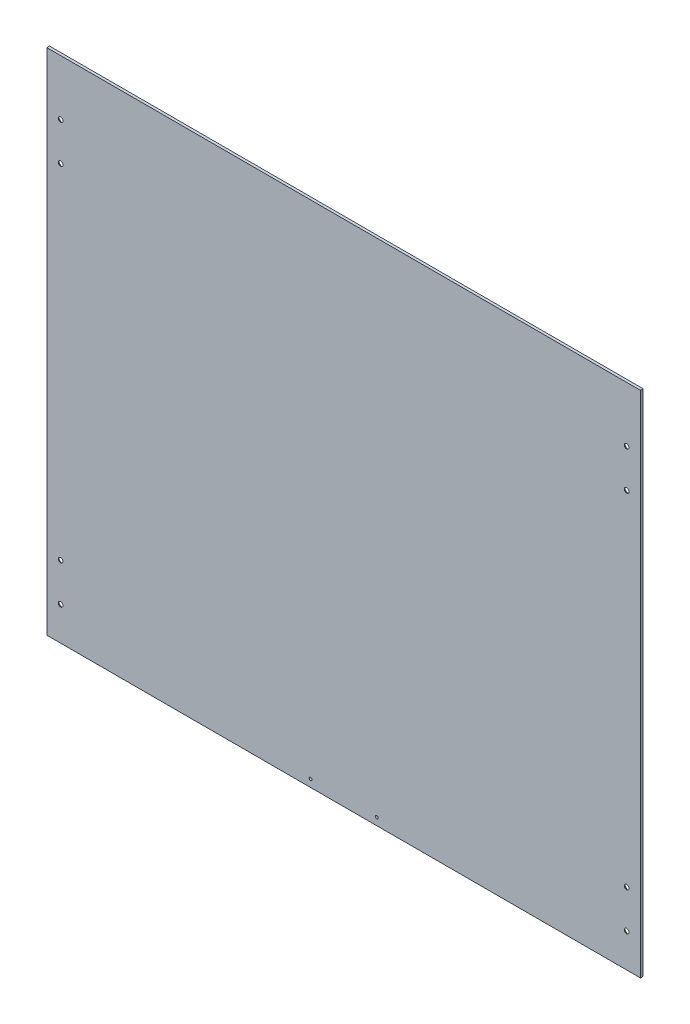
ISO-10303-21;
HEADER;
FILE_DESCRIPTION(('STEP AP214'),'2;1');
FILE_NAME('part.step','',(''),(''),'','','');
FILE_SCHEMA(('AUTOMOTIVE_DESIGN { 1 0 10303 214 1 1 1 1 }'));
ENDSEC;
DATA;
#1=APPLICATION_CONTEXT('core data for automotive mechanical design processes');
#2=APPLICATION_PROTOCOL_DEFINITION('international standard','automotive_design',2000,#1);
#3=PRODUCT_CONTEXT('',#1,'mechanical');
#4=PRODUCT('Part','Part','',(#3));
#5=PRODUCT_RELATED_PRODUCT_CATEGORY('part','',(#4));
#6=PRODUCT_DEFINITION_FORMATION('','',#4);
#7=PRODUCT_DEFINITION_CONTEXT('part definition',#1,'design');
#8=PRODUCT_DEFINITION('design','',#6,#7);
#9=PRODUCT_DEFINITION_SHAPE('','',#8);
#10=(LENGTH_UNIT() NAMED_UNIT(*) SI_UNIT(.MILLI.,.METRE.));
#11=(NAMED_UNIT(*) PLANE_ANGLE_UNIT() SI_UNIT($,.RADIAN.));
#12=(NAMED_UNIT(*) SI_UNIT($,.STERADIAN.) SOLID_ANGLE_UNIT());
#13=UNCERTAINTY_MEASURE_WITH_UNIT(LENGTH_MEASURE(1.E-05),#10,'distance_accuracy_value','');
#14=(GEOMETRIC_REPRESENTATION_CONTEXT(3) GLOBAL_UNCERTAINTY_ASSIGNED_CONTEXT((#13)) GLOBAL_UNIT_ASSIGNED_CONTEXT((#10,
#11,#12)) REPRESENTATION_CONTEXT('',''));
#15=CARTESIAN_POINT('',(0.,0.,0.));
#16=DIRECTION('',(0.,0.,1.));
#17=DIRECTION('',(1.,0.,0.));
#18=AXIS2_PLACEMENT_3D('',#15,#16,#17);
#19=CARTESIAN_POINT('',(-350.,300.,1.5875));
#20=DIRECTION('',(1.,0.,0.));
#21=DIRECTION('',(0.,1.,0.));
#22=AXIS2_PLACEMENT_3D('',#19,#20,#21);
#23=PLANE('',#22);
#24=DIRECTION('',(0.,-1.,0.));
#25=VECTOR('',#24,1.);
#26=CARTESIAN_POINT('',(-350.,300.,-1.5875));
#27=LINE('',#26,#25);
#28=CARTESIAN_POINT('',(-350.,300.,-1.5875));
#29=VERTEX_POINT('',#28);
#30=CARTESIAN_POINT('',(-350.,-300.,-1.5875));
#31=VERTEX_POINT('',#30);
#32=EDGE_CURVE('E99',#29,#31,#27,.T.);
#33=ORIENTED_EDGE('',*,*,#32,.T.);
#34=DIRECTION('',(0.,0.,-1.));
#35=VECTOR('',#34,1.);
#36=CARTESIAN_POINT('',(-350.,-300.,1.5875));
#37=LINE('',#36,#35);
#38=CARTESIAN_POINT('',(-350.,-300.,1.5875));
#39=VERTEX_POINT('',#38);
#40=EDGE_CURVE('E11',#39,#31,#37,.T.);
#41=ORIENTED_EDGE('',*,*,#40,.F.);
#42=DIRECTION('',(0.,-1.,0.));
#43=VECTOR('',#42,1.);
#44=CARTESIAN_POINT('',(-350.,300.,1.5875));
#45=LINE('',#44,#43);
#46=CARTESIAN_POINT('',(-350.,300.,1.5875));
#47=VERTEX_POINT('',#46);
#48=EDGE_CURVE('E87',#47,#39,#45,.T.);
#49=ORIENTED_EDGE('',*,*,#48,.F.);
#50=DIRECTION('',(0.,0.,-1.));
#51=VECTOR('',#50,1.);
#52=CARTESIAN_POINT('',(-350.,300.,1.5875));
#53=LINE('',#52,#51);
#54=EDGE_CURVE('E95',#47,#29,#53,.T.);
#55=ORIENTED_EDGE('',*,*,#54,.T.);
#56=EDGE_LOOP('',(#33,#41,#49,#55));
#57=FACE_BOUND('',#56,.T.);
#58=ADVANCED_FACE('F36',(#57),#23,.F.);
#59=CARTESIAN_POINT('',(-350.,-300.,1.5875));
#60=DIRECTION('',(0.,1.,0.));
#61=DIRECTION('',(0.,0.,1.));
#62=AXIS2_PLACEMENT_3D('',#59,#60,#61);
#63=PLANE('',#62);
#64=DIRECTION('',(1.,0.,0.));
#65=VECTOR('',#64,1.);
#66=CARTESIAN_POINT('',(-350.,-300.,-1.5875));
#67=LINE('',#66,#65);
#68=CARTESIAN_POINT('',(350.,-300.,-1.5875));
#69=VERTEX_POINT('',#68);
#70=EDGE_CURVE('E91',#31,#69,#67,.T.);
#71=ORIENTED_EDGE('',*,*,#70,.T.);
#72=DIRECTION('',(0.,0.,-1.));
#73=VECTOR('',#72,1.);
#74=CARTESIAN_POINT('',(350.,-300.,1.5875));
#75=LINE('',#74,#73);
#76=CARTESIAN_POINT('',(350.,-300.,1.5875));
#77=VERTEX_POINT('',#76);
#78=EDGE_CURVE('E44',#77,#69,#75,.T.);
#79=ORIENTED_EDGE('',*,*,#78,.F.);
#80=DIRECTION('',(1.,0.,0.));
#81=VECTOR('',#80,1.);
#82=CARTESIAN_POINT('',(-350.,-300.,1.5875));
#83=LINE('',#82,#81);
#84=EDGE_CURVE('E82',#39,#77,#83,.T.);
#85=ORIENTED_EDGE('',*,*,#84,.F.);
#86=ORIENTED_EDGE('',*,*,#40,.T.);
#87=EDGE_LOOP('',(#71,#79,#85,#86));
#88=FACE_BOUND('',#87,.T.);
#89=ADVANCED_FACE('F90',(#88),#63,.F.);
#90=CARTESIAN_POINT('',(350.,300.,1.5875));
#91=DIRECTION('',(-1.,0.,0.));
#92=DIRECTION('',(0.,-1.,0.));
#93=AXIS2_PLACEMENT_3D('',#90,#91,#92);
#94=PLANE('',#93);
#95=DIRECTION('',(0.,1.,0.));
#96=VECTOR('',#95,1.);
#97=CARTESIAN_POINT('',(350.,300.,-1.5875));
#98=LINE('',#97,#96);
#99=CARTESIAN_POINT('',(350.,300.,-1.5875));
#100=VERTEX_POINT('',#99);
#101=EDGE_CURVE('E69',#69,#100,#98,.T.);
#102=ORIENTED_EDGE('',*,*,#101,.T.);
#103=DIRECTION('',(0.,0.,-1.));
#104=VECTOR('',#103,1.);
#105=CARTESIAN_POINT('',(350.,300.,1.5875));
#106=LINE('',#105,#104);
#107=CARTESIAN_POINT('',(350.,300.,1.5875));
#108=VERTEX_POINT('',#107);
#109=EDGE_CURVE('E92',#108,#100,#106,.T.);
#110=ORIENTED_EDGE('',*,*,#109,.F.);
#111=DIRECTION('',(0.,1.,0.));
#112=VECTOR('',#111,1.);
#113=CARTESIAN_POINT('',(350.,300.,1.5875));
#114=LINE('',#113,#112);
#115=EDGE_CURVE('E85',#77,#108,#114,.T.);
#116=ORIENTED_EDGE('',*,*,#115,.F.);
#117=ORIENTED_EDGE('',*,*,#78,.T.);
#118=EDGE_LOOP('',(#102,#110,#116,#117));
#119=FACE_BOUND('',#118,.T.);
#120=ADVANCED_FACE('F93',(#119),#94,.F.);
#121=CARTESIAN_POINT('',(-350.,300.,1.5875));
#122=DIRECTION('',(0.,-1.,0.));
#123=DIRECTION('',(1.,0.,0.));
#124=AXIS2_PLACEMENT_3D('',#121,#122,#123);
#125=PLANE('',#124);
#126=DIRECTION('',(-1.,0.,0.));
#127=VECTOR('',#126,1.);
#128=CARTESIAN_POINT('',(-350.,300.,-1.5875));
#129=LINE('',#128,#127);
#130=EDGE_CURVE('E75',#100,#29,#129,.T.);
#131=ORIENTED_EDGE('',*,*,#130,.T.);
#132=ORIENTED_EDGE('',*,*,#54,.F.);
#133=DIRECTION('',(-1.,0.,0.));
#134=VECTOR('',#133,1.);
#135=CARTESIAN_POINT('',(-350.,300.,1.5875));
#136=LINE('',#135,#134);
#137=EDGE_CURVE('E52',#108,#47,#136,.T.);
#138=ORIENTED_EDGE('',*,*,#137,.F.);
#139=ORIENTED_EDGE('',*,*,#109,.T.);
#140=EDGE_LOOP('',(#131,#132,#138,#139));
#141=FACE_BOUND('',#140,.T.);
#142=ADVANCED_FACE('F107',(#141),#125,.F.);
#143=CARTESIAN_POINT('',(-350.,300.,1.5875));
#144=DIRECTION('',(0.,0.,1.));
#145=DIRECTION('',(1.,0.,0.));
#146=AXIS2_PLACEMENT_3D('',#143,#144,#145);
#147=PLANE('',#146);
#148=CARTESIAN_POINT('',(-39.,-291.25,1.5875));
#149=DIRECTION('',(0.,0.,1.));
#150=DIRECTION('',(1.,0.,0.));
#151=AXIS2_PLACEMENT_3D('',#148,#149,#150);
#152=CIRCLE('',#151,1.64999999999998);
#153=CARTESIAN_POINT('',(-37.35,-291.25,1.5875));
#154=VERTEX_POINT('',#153);
#155=EDGE_CURVE('E193',#154,#154,#152,.T.);
#156=ORIENTED_EDGE('',*,*,#155,.F.);
#157=EDGE_LOOP('',(#156));
#158=FACE_BOUND('',#157,.T.);
#159=CARTESIAN_POINT('',(39.,-291.25,1.5875));
#160=DIRECTION('',(0.,0.,1.));
#161=DIRECTION('',(1.,0.,0.));
#162=AXIS2_PLACEMENT_3D('',#159,#160,#161);
#163=CIRCLE('',#162,1.64999999999998);
#164=CARTESIAN_POINT('',(40.65,-291.25,1.5875));
#165=VERTEX_POINT('',#164);
#166=EDGE_CURVE('E187',#165,#165,#163,.T.);
#167=ORIENTED_EDGE('',*,*,#166,.F.);
#168=EDGE_LOOP('',(#167));
#169=FACE_BOUND('',#168,.T.);
#170=CARTESIAN_POINT('',(333.65,234.7,1.5875));
#171=DIRECTION('',(0.,0.,-1.));
#172=DIRECTION('',(-1.,0.,0.));
#173=AXIS2_PLACEMENT_3D('',#170,#171,#172);
#174=CIRCLE('',#173,2.74999999999997);
#175=CARTESIAN_POINT('',(330.9,234.7,1.5875));
#176=VERTEX_POINT('',#175);
#177=EDGE_CURVE('E175',#176,#176,#174,.T.);
#178=ORIENTED_EDGE('',*,*,#177,.T.);
#179=EDGE_LOOP('',(#178));
#180=FACE_BOUND('',#179,.T.);
#181=CARTESIAN_POINT('',(333.65,189.7,1.5875));
#182=DIRECTION('',(0.,0.,-1.));
#183=DIRECTION('',(-1.,0.,0.));
#184=AXIS2_PLACEMENT_3D('',#181,#182,#183);
#185=CIRCLE('',#184,2.74999999999997);
#186=CARTESIAN_POINT('',(330.9,189.7,1.5875));
#187=VERTEX_POINT('',#186);
#188=EDGE_CURVE('E166',#187,#187,#185,.T.);
#189=ORIENTED_EDGE('',*,*,#188,.T.);
#190=EDGE_LOOP('',(#189));
#191=FACE_BOUND('',#190,.T.);
#192=CARTESIAN_POINT('',(333.65,-215.3,1.5875));
#193=DIRECTION('',(0.,0.,-1.));
#194=DIRECTION('',(-1.,0.,0.));
#195=AXIS2_PLACEMENT_3D('',#192,#193,#194);
#196=CIRCLE('',#195,2.74999999999997);
#197=CARTESIAN_POINT('',(330.9,-215.3,1.5875));
#198=VERTEX_POINT('',#197);
#199=EDGE_CURVE('E157',#198,#198,#196,.T.);
#200=ORIENTED_EDGE('',*,*,#199,.T.);
#201=EDGE_LOOP('',(#200));
#202=FACE_BOUND('',#201,.T.);
#203=CARTESIAN_POINT('',(333.65,-260.3,1.5875));
#204=DIRECTION('',(0.,0.,-1.));
#205=DIRECTION('',(-1.,0.,0.));
#206=AXIS2_PLACEMENT_3D('',#203,#204,#205);
#207=CIRCLE('',#206,2.74999999999997);
#208=CARTESIAN_POINT('',(330.9,-260.3,1.5875));
#209=VERTEX_POINT('',#208);
#210=EDGE_CURVE('E148',#209,#209,#207,.T.);
#211=ORIENTED_EDGE('',*,*,#210,.T.);
#212=EDGE_LOOP('',(#211));
#213=FACE_BOUND('',#212,.T.);
#214=CARTESIAN_POINT('',(-333.65,-260.3,1.5875));
#215=DIRECTION('',(0.,0.,-1.));
#216=DIRECTION('',(-1.,0.,0.));
#217=AXIS2_PLACEMENT_3D('',#214,#215,#216);
#218=CIRCLE('',#217,2.74999999999997);
#219=CARTESIAN_POINT('',(-336.4,-260.3,1.5875));
#220=VERTEX_POINT('',#219);
#221=EDGE_CURVE('E139',#220,#220,#218,.T.);
#222=ORIENTED_EDGE('',*,*,#221,.T.);
#223=EDGE_LOOP('',(#222));
#224=FACE_BOUND('',#223,.T.);
#225=CARTESIAN_POINT('',(-333.65,-215.3,1.5875));
#226=DIRECTION('',(0.,0.,-1.));
#227=DIRECTION('',(-1.,0.,0.));
#228=AXIS2_PLACEMENT_3D('',#225,#226,#227);
#229=CIRCLE('',#228,2.74999999999997);
#230=CARTESIAN_POINT('',(-336.4,-215.3,1.5875));
#231=VERTEX_POINT('',#230);
#232=EDGE_CURVE('E130',#231,#231,#229,.T.);
#233=ORIENTED_EDGE('',*,*,#232,.T.);
#234=EDGE_LOOP('',(#233));
#235=FACE_BOUND('',#234,.T.);
#236=CARTESIAN_POINT('',(-333.65,189.7,1.5875));
#237=DIRECTION('',(0.,0.,-1.));
#238=DIRECTION('',(-1.,0.,0.));
#239=AXIS2_PLACEMENT_3D('',#236,#237,#238);
#240=CIRCLE('',#239,2.74999999999997);
#241=CARTESIAN_POINT('',(-336.4,189.7,1.5875));
#242=VERTEX_POINT('',#241);
#243=EDGE_CURVE('E121',#242,#242,#240,.T.);
#244=ORIENTED_EDGE('',*,*,#243,.T.);
#245=EDGE_LOOP('',(#244));
#246=FACE_BOUND('',#245,.T.);
#247=CARTESIAN_POINT('',(-333.65,234.7,1.5875));
#248=DIRECTION('',(0.,0.,-1.));
#249=DIRECTION('',(-1.,0.,0.));
#250=AXIS2_PLACEMENT_3D('',#247,#248,#249);
#251=CIRCLE('',#250,2.74999999999997);
#252=CARTESIAN_POINT('',(-336.4,234.7,1.5875));
#253=VERTEX_POINT('',#252);
#254=EDGE_CURVE('E102',#253,#253,#251,.T.);
#255=ORIENTED_EDGE('',*,*,#254,.T.);
#256=EDGE_LOOP('',(#255));
#257=FACE_BOUND('',#256,.T.);
#258=ORIENTED_EDGE('',*,*,#48,.T.);
#259=ORIENTED_EDGE('',*,*,#84,.T.);
#260=ORIENTED_EDGE('',*,*,#115,.T.);
#261=ORIENTED_EDGE('',*,*,#137,.T.);
#262=EDGE_LOOP('',(#258,#259,#260,#261));
#263=FACE_BOUND('',#262,.T.);
#264=ADVANCED_FACE('F83',(#158,#169,#180,#191,#202,#213,#224,#235,#246,#257,#263),#147,.T.);
#265=CARTESIAN_POINT('',(-350.,300.,-1.5875));
#266=DIRECTION('',(0.,0.,1.));
#267=DIRECTION('',(1.,0.,0.));
#268=AXIS2_PLACEMENT_3D('',#265,#266,#267);
#269=PLANE('',#268);
#270=CARTESIAN_POINT('',(-39.,-291.25,-1.5875));
#271=DIRECTION('',(0.,0.,1.));
#272=DIRECTION('',(1.,0.,0.));
#273=AXIS2_PLACEMENT_3D('',#270,#271,#272);
#274=CIRCLE('',#273,1.65);
#275=CARTESIAN_POINT('',(-37.35,-291.25,-1.5875));
#276=VERTEX_POINT('',#275);
#277=EDGE_CURVE('E190',#276,#276,#274,.T.);
#278=ORIENTED_EDGE('',*,*,#277,.T.);
#279=EDGE_LOOP('',(#278));
#280=FACE_BOUND('',#279,.T.);
#281=CARTESIAN_POINT('',(39.,-291.25,-1.5875));
#282=DIRECTION('',(0.,0.,1.));
#283=DIRECTION('',(1.,0.,0.));
#284=AXIS2_PLACEMENT_3D('',#281,#282,#283);
#285=CIRCLE('',#284,1.65);
#286=CARTESIAN_POINT('',(40.65,-291.25,-1.5875));
#287=VERTEX_POINT('',#286);
#288=EDGE_CURVE('E184',#287,#287,#285,.T.);
#289=ORIENTED_EDGE('',*,*,#288,.T.);
#290=EDGE_LOOP('',(#289));
#291=FACE_BOUND('',#290,.T.);
#292=CARTESIAN_POINT('',(333.65,234.7,-1.5875));
#293=DIRECTION('',(0.,0.,-1.));
#294=DIRECTION('',(-1.,0.,0.));
#295=AXIS2_PLACEMENT_3D('',#292,#293,#294);
#296=CIRCLE('',#295,5.74999999999998);
#297=CARTESIAN_POINT('',(327.9,234.7,-1.5875));
#298=VERTEX_POINT('',#297);
#299=EDGE_CURVE('E181',#298,#298,#296,.T.);
#300=ORIENTED_EDGE('',*,*,#299,.F.);
#301=EDGE_LOOP('',(#300));
#302=FACE_BOUND('',#301,.T.);
#303=CARTESIAN_POINT('',(333.65,189.7,-1.5875));
#304=DIRECTION('',(0.,0.,-1.));
#305=DIRECTION('',(-1.,0.,0.));
#306=AXIS2_PLACEMENT_3D('',#303,#304,#305);
#307=CIRCLE('',#306,5.74999999999998);
#308=CARTESIAN_POINT('',(327.9,189.7,-1.5875));
#309=VERTEX_POINT('',#308);
#310=EDGE_CURVE('E172',#309,#309,#307,.T.);
#311=ORIENTED_EDGE('',*,*,#310,.F.);
#312=EDGE_LOOP('',(#311));
#313=FACE_BOUND('',#312,.T.);
#314=CARTESIAN_POINT('',(333.65,-215.3,-1.5875));
#315=DIRECTION('',(0.,0.,-1.));
#316=DIRECTION('',(-1.,0.,0.));
#317=AXIS2_PLACEMENT_3D('',#314,#315,#316);
#318=CIRCLE('',#317,5.74999999999998);
#319=CARTESIAN_POINT('',(327.9,-215.3,-1.5875));
#320=VERTEX_POINT('',#319);
#321=EDGE_CURVE('E163',#320,#320,#318,.T.);
#322=ORIENTED_EDGE('',*,*,#321,.F.);
#323=EDGE_LOOP('',(#322));
#324=FACE_BOUND('',#323,.T.);
#325=CARTESIAN_POINT('',(333.65,-260.3,-1.5875));
#326=DIRECTION('',(0.,0.,-1.));
#327=DIRECTION('',(-1.,0.,0.));
#328=AXIS2_PLACEMENT_3D('',#325,#326,#327);
#329=CIRCLE('',#328,5.74999999999998);
#330=CARTESIAN_POINT('',(327.9,-260.3,-1.5875));
#331=VERTEX_POINT('',#330);
#332=EDGE_CURVE('E154',#331,#331,#329,.T.);
#333=ORIENTED_EDGE('',*,*,#332,.F.);
#334=EDGE_LOOP('',(#333));
#335=FACE_BOUND('',#334,.T.);
#336=CARTESIAN_POINT('',(-333.65,-260.3,-1.5875));
#337=DIRECTION('',(0.,0.,-1.));
#338=DIRECTION('',(-1.,0.,0.));
#339=AXIS2_PLACEMENT_3D('',#336,#337,#338);
#340=CIRCLE('',#339,5.74999999999998);
#341=CARTESIAN_POINT('',(-339.4,-260.3,-1.5875));
#342=VERTEX_POINT('',#341);
#343=EDGE_CURVE('E145',#342,#342,#340,.T.);
#344=ORIENTED_EDGE('',*,*,#343,.F.);
#345=EDGE_LOOP('',(#344));
#346=FACE_BOUND('',#345,.T.);
#347=CARTESIAN_POINT('',(-333.65,-215.3,-1.5875));
#348=DIRECTION('',(0.,0.,-1.));
#349=DIRECTION('',(-1.,0.,0.));
#350=AXIS2_PLACEMENT_3D('',#347,#348,#349);
#351=CIRCLE('',#350,5.74999999999998);
#352=CARTESIAN_POINT('',(-339.4,-215.3,-1.5875));
#353=VERTEX_POINT('',#352);
#354=EDGE_CURVE('E136',#353,#353,#351,.T.);
#355=ORIENTED_EDGE('',*,*,#354,.F.);
#356=EDGE_LOOP('',(#355));
#357=FACE_BOUND('',#356,.T.);
#358=CARTESIAN_POINT('',(-333.65,189.7,-1.5875));
#359=DIRECTION('',(0.,0.,-1.));
#360=DIRECTION('',(-1.,0.,0.));
#361=AXIS2_PLACEMENT_3D('',#358,#359,#360);
#362=CIRCLE('',#361,5.74999999999998);
#363=CARTESIAN_POINT('',(-339.4,189.7,-1.5875));
#364=VERTEX_POINT('',#363);
#365=EDGE_CURVE('E127',#364,#364,#362,.T.);
#366=ORIENTED_EDGE('',*,*,#365,.F.);
#367=EDGE_LOOP('',(#366));
#368=FACE_BOUND('',#367,.T.);
#369=CARTESIAN_POINT('',(-333.65,234.7,-1.5875));
#370=DIRECTION('',(0.,0.,-1.));
#371=DIRECTION('',(-1.,0.,0.));
#372=AXIS2_PLACEMENT_3D('',#369,#370,#371);
#373=CIRCLE('',#372,5.74999999999998);
#374=CARTESIAN_POINT('',(-339.4,234.7,-1.5875));
#375=VERTEX_POINT('',#374);
#376=EDGE_CURVE('E118',#375,#375,#373,.T.);
#377=ORIENTED_EDGE('',*,*,#376,.F.);
#378=EDGE_LOOP('',(#377));
#379=FACE_BOUND('',#378,.T.);
#380=ORIENTED_EDGE('',*,*,#32,.F.);
#381=ORIENTED_EDGE('',*,*,#130,.F.);
#382=ORIENTED_EDGE('',*,*,#101,.F.);
#383=ORIENTED_EDGE('',*,*,#70,.F.);
#384=EDGE_LOOP('',(#380,#381,#382,#383));
#385=FACE_BOUND('',#384,.T.);
#386=ADVANCED_FACE('F110',(#280,#291,#302,#313,#324,#335,#346,#357,#368,#379,#385),#269,.F.);
#387=CARTESIAN_POINT('',(-333.65,234.7,-1.5875));
#388=DIRECTION('',(0.,0.,-1.));
#389=DIRECTION('',(-1.,0.,0.));
#390=AXIS2_PLACEMENT_3D('',#387,#388,#389);
#391=CYLINDRICAL_SURFACE('',#390,2.74999999999997);
#392=ORIENTED_EDGE('',*,*,#254,.F.);
#393=EDGE_LOOP('',(#392));
#394=FACE_BOUND('',#393,.T.);
#395=CARTESIAN_POINT('',(-333.65,234.7,1.41250000000002));
#396=DIRECTION('',(0.,0.,-1.));
#397=DIRECTION('',(-1.,0.,0.));
#398=AXIS2_PLACEMENT_3D('',#395,#396,#397);
#399=CIRCLE('',#398,2.74999999999997);
#400=CARTESIAN_POINT('',(-336.4,234.7,1.41250000000002));
#401=VERTEX_POINT('',#400);
#402=EDGE_CURVE('E115',#401,#401,#399,.T.);
#403=ORIENTED_EDGE('',*,*,#402,.T.);
#404=EDGE_LOOP('',(#403));
#405=FACE_BOUND('',#404,.T.);
#406=ADVANCED_FACE('F220',(#394,#405),#391,.F.);
#407=CARTESIAN_POINT('',(-333.65,234.7,-1.5875));
#408=DIRECTION('',(0.,0.,-1.));
#409=DIRECTION('',(-1.,0.,0.));
#410=AXIS2_PLACEMENT_3D('',#407,#408,#409);
#411=CONICAL_SURFACE('',#410,5.74999999999998,0.785398163397446);
#412=ORIENTED_EDGE('',*,*,#402,.F.);
#413=EDGE_LOOP('',(#412));
#414=FACE_BOUND('',#413,.T.);
#415=ORIENTED_EDGE('',*,*,#376,.T.);
#416=EDGE_LOOP('',(#415));
#417=FACE_BOUND('',#416,.T.);
#418=ADVANCED_FACE('F223',(#414,#417),#411,.F.);
#419=CARTESIAN_POINT('',(-333.65,189.7,-1.5875));
#420=DIRECTION('',(0.,0.,-1.));
#421=DIRECTION('',(-1.,0.,0.));
#422=AXIS2_PLACEMENT_3D('',#419,#420,#421);
#423=CYLINDRICAL_SURFACE('',#422,2.74999999999997);
#424=ORIENTED_EDGE('',*,*,#243,.F.);
#425=EDGE_LOOP('',(#424));
#426=FACE_BOUND('',#425,.T.);
#427=CARTESIAN_POINT('',(-333.65,189.7,1.41250000000002));
#428=DIRECTION('',(0.,0.,-1.));
#429=DIRECTION('',(-1.,0.,0.));
#430=AXIS2_PLACEMENT_3D('',#427,#428,#429);
#431=CIRCLE('',#430,2.74999999999997);
#432=CARTESIAN_POINT('',(-336.4,189.7,1.41250000000002));
#433=VERTEX_POINT('',#432);
#434=EDGE_CURVE('E124',#433,#433,#431,.T.);
#435=ORIENTED_EDGE('',*,*,#434,.T.);
#436=EDGE_LOOP('',(#435));
#437=FACE_BOUND('',#436,.T.);
#438=ADVANCED_FACE('F229',(#426,#437),#423,.F.);
#439=CARTESIAN_POINT('',(-333.65,189.7,-1.5875));
#440=DIRECTION('',(0.,0.,-1.));
#441=DIRECTION('',(-1.,0.,0.));
#442=AXIS2_PLACEMENT_3D('',#439,#440,#441);
#443=CONICAL_SURFACE('',#442,5.74999999999998,0.785398163397446);
#444=ORIENTED_EDGE('',*,*,#434,.F.);
#445=EDGE_LOOP('',(#444));
#446=FACE_BOUND('',#445,.T.);
#447=ORIENTED_EDGE('',*,*,#365,.T.);
#448=EDGE_LOOP('',(#447));
#449=FACE_BOUND('',#448,.T.);
#450=ADVANCED_FACE('F383',(#446,#449),#443,.F.);
#451=CARTESIAN_POINT('',(-333.65,-215.3,-1.5875));
#452=DIRECTION('',(0.,0.,-1.));
#453=DIRECTION('',(-1.,0.,0.));
#454=AXIS2_PLACEMENT_3D('',#451,#452,#453);
#455=CYLINDRICAL_SURFACE('',#454,2.74999999999997);
#456=ORIENTED_EDGE('',*,*,#232,.F.);
#457=EDGE_LOOP('',(#456));
#458=FACE_BOUND('',#457,.T.);
#459=CARTESIAN_POINT('',(-333.65,-215.3,1.41250000000002));
#460=DIRECTION('',(0.,0.,-1.));
#461=DIRECTION('',(-1.,0.,0.));
#462=AXIS2_PLACEMENT_3D('',#459,#460,#461);
#463=CIRCLE('',#462,2.74999999999997);
#464=CARTESIAN_POINT('',(-336.4,-215.3,1.41250000000002));
#465=VERTEX_POINT('',#464);
#466=EDGE_CURVE('E133',#465,#465,#463,.T.);
#467=ORIENTED_EDGE('',*,*,#466,.T.);
#468=EDGE_LOOP('',(#467));
#469=FACE_BOUND('',#468,.T.);
#470=ADVANCED_FACE('F375',(#458,#469),#455,.F.);
#471=CARTESIAN_POINT('',(-333.65,-215.3,-1.5875));
#472=DIRECTION('',(0.,0.,-1.));
#473=DIRECTION('',(-1.,0.,0.));
#474=AXIS2_PLACEMENT_3D('',#471,#472,#473);
#475=CONICAL_SURFACE('',#474,5.74999999999998,0.785398163397446);
#476=ORIENTED_EDGE('',*,*,#466,.F.);
#477=EDGE_LOOP('',(#476));
#478=FACE_BOUND('',#477,.T.);
#479=ORIENTED_EDGE('',*,*,#354,.T.);
#480=EDGE_LOOP('',(#479));
#481=FACE_BOUND('',#480,.T.);
#482=ADVANCED_FACE('F367',(#478,#481),#475,.F.);
#483=CARTESIAN_POINT('',(-333.65,-260.3,-1.5875));
#484=DIRECTION('',(0.,0.,-1.));
#485=DIRECTION('',(-1.,0.,0.));
#486=AXIS2_PLACEMENT_3D('',#483,#484,#485);
#487=CYLINDRICAL_SURFACE('',#486,2.74999999999997);
#488=ORIENTED_EDGE('',*,*,#221,.F.);
#489=EDGE_LOOP('',(#488));
#490=FACE_BOUND('',#489,.T.);
#491=CARTESIAN_POINT('',(-333.65,-260.3,1.41250000000002));
#492=DIRECTION('',(0.,0.,-1.));
#493=DIRECTION('',(-1.,0.,0.));
#494=AXIS2_PLACEMENT_3D('',#491,#492,#493);
#495=CIRCLE('',#494,2.74999999999997);
#496=CARTESIAN_POINT('',(-336.4,-260.3,1.41250000000002));
#497=VERTEX_POINT('',#496);
#498=EDGE_CURVE('E142',#497,#497,#495,.T.);
#499=ORIENTED_EDGE('',*,*,#498,.T.);
#500=EDGE_LOOP('',(#499));
#501=FACE_BOUND('',#500,.T.);
#502=ADVANCED_FACE('F359',(#490,#501),#487,.F.);
#503=CARTESIAN_POINT('',(-333.65,-260.3,-1.5875));
#504=DIRECTION('',(0.,0.,-1.));
#505=DIRECTION('',(-1.,0.,0.));
#506=AXIS2_PLACEMENT_3D('',#503,#504,#505);
#507=CONICAL_SURFACE('',#506,5.74999999999998,0.785398163397446);
#508=ORIENTED_EDGE('',*,*,#498,.F.);
#509=EDGE_LOOP('',(#508));
#510=FACE_BOUND('',#509,.T.);
#511=ORIENTED_EDGE('',*,*,#343,.T.);
#512=EDGE_LOOP('',(#511));
#513=FACE_BOUND('',#512,.T.);
#514=ADVANCED_FACE('F351',(#510,#513),#507,.F.);
#515=CARTESIAN_POINT('',(333.65,-260.3,-1.5875));
#516=DIRECTION('',(0.,0.,-1.));
#517=DIRECTION('',(-1.,0.,0.));
#518=AXIS2_PLACEMENT_3D('',#515,#516,#517);
#519=CYLINDRICAL_SURFACE('',#518,2.74999999999997);
#520=ORIENTED_EDGE('',*,*,#210,.F.);
#521=EDGE_LOOP('',(#520));
#522=FACE_BOUND('',#521,.T.);
#523=CARTESIAN_POINT('',(333.65,-260.3,1.41250000000002));
#524=DIRECTION('',(0.,0.,-1.));
#525=DIRECTION('',(-1.,0.,0.));
#526=AXIS2_PLACEMENT_3D('',#523,#524,#525);
#527=CIRCLE('',#526,2.74999999999997);
#528=CARTESIAN_POINT('',(330.9,-260.3,1.41250000000002));
#529=VERTEX_POINT('',#528);
#530=EDGE_CURVE('E151',#529,#529,#527,.T.);
#531=ORIENTED_EDGE('',*,*,#530,.T.);
#532=EDGE_LOOP('',(#531));
#533=FACE_BOUND('',#532,.T.);
#534=ADVANCED_FACE('F343',(#522,#533),#519,.F.);
#535=CARTESIAN_POINT('',(333.65,-260.3,-1.5875));
#536=DIRECTION('',(0.,0.,-1.));
#537=DIRECTION('',(-1.,0.,0.));
#538=AXIS2_PLACEMENT_3D('',#535,#536,#537);
#539=CONICAL_SURFACE('',#538,5.74999999999998,0.785398163397446);
#540=ORIENTED_EDGE('',*,*,#530,.F.);
#541=EDGE_LOOP('',(#540));
#542=FACE_BOUND('',#541,.T.);
#543=ORIENTED_EDGE('',*,*,#332,.T.);
#544=EDGE_LOOP('',(#543));
#545=FACE_BOUND('',#544,.T.);
#546=ADVANCED_FACE('F335',(#542,#545),#539,.F.);
#547=CARTESIAN_POINT('',(333.65,-215.3,-1.5875));
#548=DIRECTION('',(0.,0.,-1.));
#549=DIRECTION('',(-1.,0.,0.));
#550=AXIS2_PLACEMENT_3D('',#547,#548,#549);
#551=CYLINDRICAL_SURFACE('',#550,2.74999999999997);
#552=ORIENTED_EDGE('',*,*,#199,.F.);
#553=EDGE_LOOP('',(#552));
#554=FACE_BOUND('',#553,.T.);
#555=CARTESIAN_POINT('',(333.65,-215.3,1.41250000000002));
#556=DIRECTION('',(0.,0.,-1.));
#557=DIRECTION('',(-1.,0.,0.));
#558=AXIS2_PLACEMENT_3D('',#555,#556,#557);
#559=CIRCLE('',#558,2.74999999999997);
#560=CARTESIAN_POINT('',(330.9,-215.3,1.41250000000002));
#561=VERTEX_POINT('',#560);
#562=EDGE_CURVE('E160',#561,#561,#559,.T.);
#563=ORIENTED_EDGE('',*,*,#562,.T.);
#564=EDGE_LOOP('',(#563));
#565=FACE_BOUND('',#564,.T.);
#566=ADVANCED_FACE('F327',(#554,#565),#551,.F.);
#567=CARTESIAN_POINT('',(333.65,-215.3,-1.5875));
#568=DIRECTION('',(0.,0.,-1.));
#569=DIRECTION('',(-1.,0.,0.));
#570=AXIS2_PLACEMENT_3D('',#567,#568,#569);
#571=CONICAL_SURFACE('',#570,5.74999999999998,0.785398163397446);
#572=ORIENTED_EDGE('',*,*,#562,.F.);
#573=EDGE_LOOP('',(#572));
#574=FACE_BOUND('',#573,.T.);
#575=ORIENTED_EDGE('',*,*,#321,.T.);
#576=EDGE_LOOP('',(#575));
#577=FACE_BOUND('',#576,.T.);
#578=ADVANCED_FACE('F319',(#574,#577),#571,.F.);
#579=CARTESIAN_POINT('',(333.65,189.7,-1.5875));
#580=DIRECTION('',(0.,0.,-1.));
#581=DIRECTION('',(-1.,0.,0.));
#582=AXIS2_PLACEMENT_3D('',#579,#580,#581);
#583=CYLINDRICAL_SURFACE('',#582,2.74999999999997);
#584=ORIENTED_EDGE('',*,*,#188,.F.);
#585=EDGE_LOOP('',(#584));
#586=FACE_BOUND('',#585,.T.);
#587=CARTESIAN_POINT('',(333.65,189.7,1.41250000000002));
#588=DIRECTION('',(0.,0.,-1.));
#589=DIRECTION('',(-1.,0.,0.));
#590=AXIS2_PLACEMENT_3D('',#587,#588,#589);
#591=CIRCLE('',#590,2.74999999999997);
#592=CARTESIAN_POINT('',(330.9,189.7,1.41250000000002));
#593=VERTEX_POINT('',#592);
#594=EDGE_CURVE('E169',#593,#593,#591,.T.);
#595=ORIENTED_EDGE('',*,*,#594,.T.);
#596=EDGE_LOOP('',(#595));
#597=FACE_BOUND('',#596,.T.);
#598=ADVANCED_FACE('F311',(#586,#597),#583,.F.);
#599=CARTESIAN_POINT('',(333.65,189.7,-1.5875));
#600=DIRECTION('',(0.,0.,-1.));
#601=DIRECTION('',(-1.,0.,0.));
#602=AXIS2_PLACEMENT_3D('',#599,#600,#601);
#603=CONICAL_SURFACE('',#602,5.74999999999998,0.785398163397446);
#604=ORIENTED_EDGE('',*,*,#594,.F.);
#605=EDGE_LOOP('',(#604));
#606=FACE_BOUND('',#605,.T.);
#607=ORIENTED_EDGE('',*,*,#310,.T.);
#608=EDGE_LOOP('',(#607));
#609=FACE_BOUND('',#608,.T.);
#610=ADVANCED_FACE('F303',(#606,#609),#603,.F.);
#611=CARTESIAN_POINT('',(333.65,234.7,-1.5875));
#612=DIRECTION('',(0.,0.,-1.));
#613=DIRECTION('',(-1.,0.,0.));
#614=AXIS2_PLACEMENT_3D('',#611,#612,#613);
#615=CYLINDRICAL_SURFACE('',#614,2.74999999999997);
#616=ORIENTED_EDGE('',*,*,#177,.F.);
#617=EDGE_LOOP('',(#616));
#618=FACE_BOUND('',#617,.T.);
#619=CARTESIAN_POINT('',(333.65,234.7,1.41250000000002));
#620=DIRECTION('',(0.,0.,-1.));
#621=DIRECTION('',(-1.,0.,0.));
#622=AXIS2_PLACEMENT_3D('',#619,#620,#621);
#623=CIRCLE('',#622,2.74999999999997);
#624=CARTESIAN_POINT('',(330.9,234.7,1.41250000000002));
#625=VERTEX_POINT('',#624);
#626=EDGE_CURVE('E178',#625,#625,#623,.T.);
#627=ORIENTED_EDGE('',*,*,#626,.T.);
#628=EDGE_LOOP('',(#627));
#629=FACE_BOUND('',#628,.T.);
#630=ADVANCED_FACE('F298',(#618,#629),#615,.F.);
#631=CARTESIAN_POINT('',(333.65,234.7,-1.5875));
#632=DIRECTION('',(0.,0.,-1.));
#633=DIRECTION('',(-1.,0.,0.));
#634=AXIS2_PLACEMENT_3D('',#631,#632,#633);
#635=CONICAL_SURFACE('',#634,5.74999999999998,0.785398163397446);
#636=ORIENTED_EDGE('',*,*,#626,.F.);
#637=EDGE_LOOP('',(#636));
#638=FACE_BOUND('',#637,.T.);
#639=ORIENTED_EDGE('',*,*,#299,.T.);
#640=EDGE_LOOP('',(#639));
#641=FACE_BOUND('',#640,.T.);
#642=ADVANCED_FACE('F264',(#638,#641),#635,.F.);
#643=CARTESIAN_POINT('',(39.,-291.25,1.5875));
#644=DIRECTION('',(0.,0.,1.));
#645=DIRECTION('',(1.,0.,0.));
#646=AXIS2_PLACEMENT_3D('',#643,#644,#645);
#647=CYLINDRICAL_SURFACE('',#646,1.64999999999999);
#648=ORIENTED_EDGE('',*,*,#288,.F.);
#649=EDGE_LOOP('',(#648));
#650=FACE_BOUND('',#649,.T.);
#651=ORIENTED_EDGE('',*,*,#166,.T.);
#652=EDGE_LOOP('',(#651));
#653=FACE_BOUND('',#652,.T.);
#654=ADVANCED_FACE('F274',(#650,#653),#647,.F.);
#655=CARTESIAN_POINT('',(-39.,-291.25,1.5875));
#656=DIRECTION('',(0.,0.,1.));
#657=DIRECTION('',(1.,0.,0.));
#658=AXIS2_PLACEMENT_3D('',#655,#656,#657);
#659=CYLINDRICAL_SURFACE('',#658,1.64999999999999);
#660=ORIENTED_EDGE('',*,*,#277,.F.);
#661=EDGE_LOOP('',(#660));
#662=FACE_BOUND('',#661,.T.);
#663=ORIENTED_EDGE('',*,*,#155,.T.);
#664=EDGE_LOOP('',(#663));
#665=FACE_BOUND('',#664,.T.);
#666=ADVANCED_FACE('F197',(#662,#665),#659,.F.);
#667=CLOSED_SHELL('',(#58,#89,#120,#142,#264,#386,#406,#418,#438,#450,#470,#482,#502,#514,#534,
#546,#566,#578,#598,#610,#630,#642,#654,#666));
#668=MANIFOLD_SOLID_BREP('B2',#667);
#669=ADVANCED_BREP_SHAPE_REPRESENTATION('',(#18,#668),#14);
#670=SHAPE_DEFINITION_REPRESENTATION(#9,#669);
ENDSEC;
END-ISO-10303-21;
